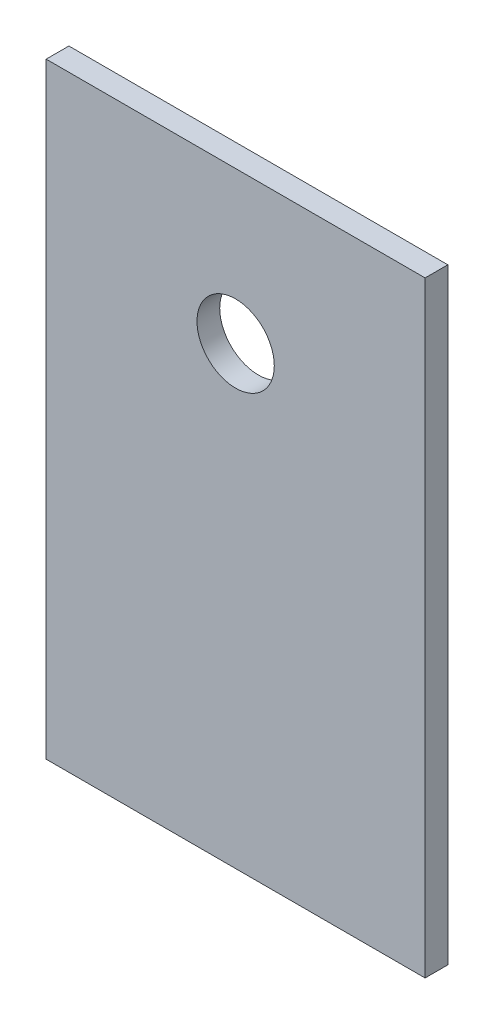
ISO-10303-21;
HEADER;
FILE_DESCRIPTION(('STEP AP214'),'2;1');
FILE_NAME('part.step','',(''),(''),'','','');
FILE_SCHEMA(('AUTOMOTIVE_DESIGN { 1 0 10303 214 1 1 1 1 }'));
ENDSEC;
DATA;
#1=APPLICATION_CONTEXT('core data for automotive mechanical design processes');
#2=APPLICATION_PROTOCOL_DEFINITION('international standard','automotive_design',2000,#1);
#3=PRODUCT_CONTEXT('',#1,'mechanical');
#4=PRODUCT('Part','Part','',(#3));
#5=PRODUCT_RELATED_PRODUCT_CATEGORY('part','',(#4));
#6=PRODUCT_DEFINITION_FORMATION('','',#4);
#7=PRODUCT_DEFINITION_CONTEXT('part definition',#1,'design');
#8=PRODUCT_DEFINITION('design','',#6,#7);
#9=PRODUCT_DEFINITION_SHAPE('','',#8);
#10=(LENGTH_UNIT() NAMED_UNIT(*) SI_UNIT(.MILLI.,.METRE.));
#11=(NAMED_UNIT(*) PLANE_ANGLE_UNIT() SI_UNIT($,.RADIAN.));
#12=(NAMED_UNIT(*) SI_UNIT($,.STERADIAN.) SOLID_ANGLE_UNIT());
#13=UNCERTAINTY_MEASURE_WITH_UNIT(LENGTH_MEASURE(1.E-05),#10,'distance_accuracy_value','');
#14=(GEOMETRIC_REPRESENTATION_CONTEXT(3) GLOBAL_UNCERTAINTY_ASSIGNED_CONTEXT((#13)) GLOBAL_UNIT_ASSIGNED_CONTEXT((#10,
#11,#12)) REPRESENTATION_CONTEXT('',''));
#15=CARTESIAN_POINT('',(0.,0.,0.));
#16=DIRECTION('',(0.,0.,1.));
#17=DIRECTION('',(1.,0.,0.));
#18=AXIS2_PLACEMENT_3D('',#15,#16,#17);
#19=CARTESIAN_POINT('',(0.,0.,3.));
#20=DIRECTION('',(0.,0.,-1.));
#21=DIRECTION('',(-1.,0.,0.));
#22=AXIS2_PLACEMENT_3D('',#19,#20,#21);
#23=PLANE('',#22);
#24=DIRECTION('',(0.,1.,0.));
#25=VECTOR('',#24,1.);
#26=CARTESIAN_POINT('',(-25.,-40.,3.));
#27=LINE('',#26,#25);
#28=CARTESIAN_POINT('',(-25.,-40.,3.));
#29=VERTEX_POINT('',#28);
#30=CARTESIAN_POINT('',(-25.,40.,3.));
#31=VERTEX_POINT('',#30);
#32=EDGE_CURVE('E95',#29,#31,#27,.T.);
#33=ORIENTED_EDGE('',*,*,#32,.F.);
#34=DIRECTION('',(1.,0.,0.));
#35=VECTOR('',#34,1.);
#36=CARTESIAN_POINT('',(-25.,-40.,3.));
#37=LINE('',#36,#35);
#38=CARTESIAN_POINT('',(25.,-40.,3.));
#39=VERTEX_POINT('',#38);
#40=EDGE_CURVE('E85',#29,#39,#37,.T.);
#41=ORIENTED_EDGE('',*,*,#40,.T.);
#42=DIRECTION('',(0.,1.,0.));
#43=VECTOR('',#42,1.);
#44=CARTESIAN_POINT('',(25.,-40.,3.));
#45=LINE('',#44,#43);
#46=CARTESIAN_POINT('',(25.,40.,3.));
#47=VERTEX_POINT('',#46);
#48=EDGE_CURVE('E80',#39,#47,#45,.T.);
#49=ORIENTED_EDGE('',*,*,#48,.T.);
#50=DIRECTION('',(1.,0.,0.));
#51=VECTOR('',#50,1.);
#52=CARTESIAN_POINT('',(-25.,40.,3.));
#53=LINE('',#52,#51);
#54=EDGE_CURVE('E84',#31,#47,#53,.T.);
#55=ORIENTED_EDGE('',*,*,#54,.F.);
#56=EDGE_LOOP('',(#33,#41,#49,#55));
#57=FACE_BOUND('',#56,.T.);
#58=CARTESIAN_POINT('',(0.,20.,3.));
#59=DIRECTION('',(0.,0.,1.));
#60=DIRECTION('',(1.,0.,0.));
#61=AXIS2_PLACEMENT_3D('',#58,#59,#60);
#62=CIRCLE('',#61,5.09999999999999);
#63=CARTESIAN_POINT('',(5.09999999999999,20.,3.));
#64=VERTEX_POINT('',#63);
#65=EDGE_CURVE('E174',#64,#64,#62,.T.);
#66=ORIENTED_EDGE('',*,*,#65,.F.);
#67=EDGE_LOOP('',(#66));
#68=FACE_BOUND('',#67,.T.);
#69=ADVANCED_FACE('F34',(#57,#68),#23,.F.);
#70=CARTESIAN_POINT('',(-25.,-40.,3.));
#71=DIRECTION('',(-1.,0.,0.));
#72=DIRECTION('',(0.,0.,1.));
#73=AXIS2_PLACEMENT_3D('',#70,#71,#72);
#74=PLANE('',#73);
#75=DIRECTION('',(0.,1.,0.));
#76=VECTOR('',#75,1.);
#77=CARTESIAN_POINT('',(-25.,-40.,0.));
#78=LINE('',#77,#76);
#79=CARTESIAN_POINT('',(-25.,-40.,0.));
#80=VERTEX_POINT('',#79);
#81=CARTESIAN_POINT('',(-25.,40.,0.));
#82=VERTEX_POINT('',#81);
#83=EDGE_CURVE('E101',#80,#82,#78,.T.);
#84=ORIENTED_EDGE('',*,*,#83,.F.);
#85=DIRECTION('',(0.,0.,-1.));
#86=VECTOR('',#85,1.);
#87=CARTESIAN_POINT('',(-25.,-40.,3.));
#88=LINE('',#87,#86);
#89=EDGE_CURVE('E11',#29,#80,#88,.T.);
#90=ORIENTED_EDGE('',*,*,#89,.F.);
#91=ORIENTED_EDGE('',*,*,#32,.T.);
#92=DIRECTION('',(0.,0.,-1.));
#93=VECTOR('',#92,1.);
#94=CARTESIAN_POINT('',(-25.,40.,3.));
#95=LINE('',#94,#93);
#96=EDGE_CURVE('E38',#31,#82,#95,.T.);
#97=ORIENTED_EDGE('',*,*,#96,.T.);
#98=EDGE_LOOP('',(#84,#90,#91,#97));
#99=FACE_BOUND('',#98,.T.);
#100=ADVANCED_FACE('F36',(#99),#74,.T.);
#101=CARTESIAN_POINT('',(-25.,-40.,3.));
#102=DIRECTION('',(0.,1.,0.));
#103=DIRECTION('',(0.,0.,1.));
#104=AXIS2_PLACEMENT_3D('',#101,#102,#103);
#105=PLANE('',#104);
#106=DIRECTION('',(1.,0.,0.));
#107=VECTOR('',#106,1.);
#108=CARTESIAN_POINT('',(-25.,-40.,0.));
#109=LINE('',#108,#107);
#110=CARTESIAN_POINT('',(25.,-40.,0.));
#111=VERTEX_POINT('',#110);
#112=EDGE_CURVE('E68',#80,#111,#109,.T.);
#113=ORIENTED_EDGE('',*,*,#112,.T.);
#114=DIRECTION('',(0.,0.,-1.));
#115=VECTOR('',#114,1.);
#116=CARTESIAN_POINT('',(25.,-40.,3.));
#117=LINE('',#116,#115);
#118=EDGE_CURVE('E44',#39,#111,#117,.T.);
#119=ORIENTED_EDGE('',*,*,#118,.F.);
#120=ORIENTED_EDGE('',*,*,#40,.F.);
#121=ORIENTED_EDGE('',*,*,#89,.T.);
#122=EDGE_LOOP('',(#113,#119,#120,#121));
#123=FACE_BOUND('',#122,.T.);
#124=ADVANCED_FACE('F112',(#123),#105,.F.);
#125=CARTESIAN_POINT('',(25.,-40.,3.));
#126=DIRECTION('',(-1.,0.,0.));
#127=DIRECTION('',(0.,0.,1.));
#128=AXIS2_PLACEMENT_3D('',#125,#126,#127);
#129=PLANE('',#128);
#130=DIRECTION('',(0.,1.,0.));
#131=VECTOR('',#130,1.);
#132=CARTESIAN_POINT('',(25.,-40.,0.));
#133=LINE('',#132,#131);
#134=CARTESIAN_POINT('',(25.,40.,0.));
#135=VERTEX_POINT('',#134);
#136=EDGE_CURVE('E92',#111,#135,#133,.T.);
#137=ORIENTED_EDGE('',*,*,#136,.T.);
#138=DIRECTION('',(0.,0.,-1.));
#139=VECTOR('',#138,1.);
#140=CARTESIAN_POINT('',(25.,40.,3.));
#141=LINE('',#140,#139);
#142=EDGE_CURVE('E89',#47,#135,#141,.T.);
#143=ORIENTED_EDGE('',*,*,#142,.F.);
#144=ORIENTED_EDGE('',*,*,#48,.F.);
#145=ORIENTED_EDGE('',*,*,#118,.T.);
#146=EDGE_LOOP('',(#137,#143,#144,#145));
#147=FACE_BOUND('',#146,.T.);
#148=ADVANCED_FACE('F90',(#147),#129,.F.);
#149=CARTESIAN_POINT('',(-25.,40.,3.));
#150=DIRECTION('',(0.,1.,0.));
#151=DIRECTION('',(0.,0.,1.));
#152=AXIS2_PLACEMENT_3D('',#149,#150,#151);
#153=PLANE('',#152);
#154=DIRECTION('',(1.,0.,0.));
#155=VECTOR('',#154,1.);
#156=CARTESIAN_POINT('',(-25.,40.,0.));
#157=LINE('',#156,#155);
#158=EDGE_CURVE('E104',#82,#135,#157,.T.);
#159=ORIENTED_EDGE('',*,*,#158,.F.);
#160=ORIENTED_EDGE('',*,*,#96,.F.);
#161=ORIENTED_EDGE('',*,*,#54,.T.);
#162=ORIENTED_EDGE('',*,*,#142,.T.);
#163=EDGE_LOOP('',(#159,#160,#161,#162));
#164=FACE_BOUND('',#163,.T.);
#165=ADVANCED_FACE('F94',(#164),#153,.T.);
#166=CARTESIAN_POINT('',(0.,0.,0.));
#167=DIRECTION('',(0.,0.,-1.));
#168=DIRECTION('',(-1.,0.,0.));
#169=AXIS2_PLACEMENT_3D('',#166,#167,#168);
#170=PLANE('',#169);
#171=CARTESIAN_POINT('',(0.,20.,0.));
#172=DIRECTION('',(0.,0.,-1.));
#173=DIRECTION('',(-1.,0.,0.));
#174=AXIS2_PLACEMENT_3D('',#171,#172,#173);
#175=CIRCLE('',#174,5.09999999999999);
#176=CARTESIAN_POINT('',(-5.09999999999999,20.,0.));
#177=VERTEX_POINT('',#176);
#178=EDGE_CURVE('E105',#177,#177,#175,.T.);
#179=ORIENTED_EDGE('',*,*,#178,.F.);
#180=EDGE_LOOP('',(#179));
#181=FACE_BOUND('',#180,.T.);
#182=ORIENTED_EDGE('',*,*,#83,.T.);
#183=ORIENTED_EDGE('',*,*,#158,.T.);
#184=ORIENTED_EDGE('',*,*,#136,.F.);
#185=ORIENTED_EDGE('',*,*,#112,.F.);
#186=EDGE_LOOP('',(#182,#183,#184,#185));
#187=FACE_BOUND('',#186,.T.);
#188=ADVANCED_FACE('F110',(#181,#187),#170,.T.);
#189=CARTESIAN_POINT('',(0.,20.,3.));
#190=DIRECTION('',(0.,0.,1.));
#191=DIRECTION('',(1.,0.,0.));
#192=AXIS2_PLACEMENT_3D('',#189,#190,#191);
#193=CYLINDRICAL_SURFACE('',#192,5.09999999999999);
#194=ORIENTED_EDGE('',*,*,#178,.T.);
#195=EDGE_LOOP('',(#194));
#196=FACE_BOUND('',#195,.T.);
#197=ORIENTED_EDGE('',*,*,#65,.T.);
#198=EDGE_LOOP('',(#197));
#199=FACE_BOUND('',#198,.T.);
#200=ADVANCED_FACE('F123',(#196,#199),#193,.F.);
#201=CLOSED_SHELL('',(#69,#100,#124,#148,#165,#188,#200));
#202=MANIFOLD_SOLID_BREP('B2',#201);
#203=ADVANCED_BREP_SHAPE_REPRESENTATION('',(#18,#202),#14);
#204=SHAPE_DEFINITION_REPRESENTATION(#9,#203);
ENDSEC;
END-ISO-10303-21;
